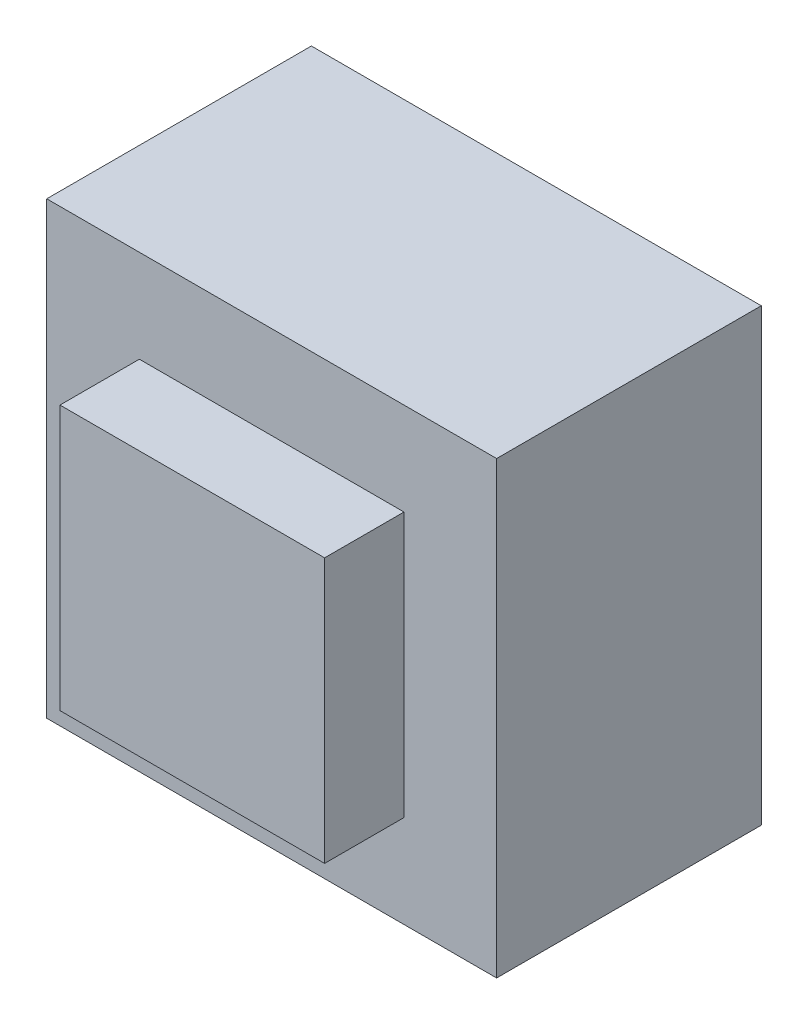
ISO-10303-21;
HEADER;
FILE_DESCRIPTION(('STEP AP214'),'2;1');
FILE_NAME('part.step','',(''),(''),'','','');
FILE_SCHEMA(('AUTOMOTIVE_DESIGN { 1 0 10303 214 1 1 1 1 }'));
ENDSEC;
DATA;
#1=APPLICATION_CONTEXT('core data for automotive mechanical design processes');
#2=APPLICATION_PROTOCOL_DEFINITION('international standard','automotive_design',2000,#1);
#3=PRODUCT_CONTEXT('',#1,'mechanical');
#4=PRODUCT('Part','Part','',(#3));
#5=PRODUCT_RELATED_PRODUCT_CATEGORY('part','',(#4));
#6=PRODUCT_DEFINITION_FORMATION('','',#4);
#7=PRODUCT_DEFINITION_CONTEXT('part definition',#1,'design');
#8=PRODUCT_DEFINITION('design','',#6,#7);
#9=PRODUCT_DEFINITION_SHAPE('','',#8);
#10=(LENGTH_UNIT() NAMED_UNIT(*) SI_UNIT(.MILLI.,.METRE.));
#11=(NAMED_UNIT(*) PLANE_ANGLE_UNIT() SI_UNIT($,.RADIAN.));
#12=(NAMED_UNIT(*) SI_UNIT($,.STERADIAN.) SOLID_ANGLE_UNIT());
#13=UNCERTAINTY_MEASURE_WITH_UNIT(LENGTH_MEASURE(1.E-05),#10,'distance_accuracy_value','');
#14=(GEOMETRIC_REPRESENTATION_CONTEXT(3) GLOBAL_UNCERTAINTY_ASSIGNED_CONTEXT((#13)) GLOBAL_UNIT_ASSIGNED_CONTEXT((#10,
#11,#12)) REPRESENTATION_CONTEXT('',''));
#15=CARTESIAN_POINT('',(0.,0.,0.));
#16=DIRECTION('',(0.,0.,1.));
#17=DIRECTION('',(1.,0.,0.));
#18=AXIS2_PLACEMENT_3D('',#15,#16,#17);
#19=CARTESIAN_POINT('',(0.,0.,1.));
#20=DIRECTION('',(0.,1.,0.));
#21=DIRECTION('',(-1.,0.,0.));
#22=AXIS2_PLACEMENT_3D('',#19,#20,#21);
#23=PLANE('',#22);
#24=DIRECTION('',(1.,0.,0.));
#25=VECTOR('',#24,1.);
#26=CARTESIAN_POINT('',(0.,0.,0.));
#27=LINE('',#26,#25);
#28=CARTESIAN_POINT('',(0.,0.,0.));
#29=VERTEX_POINT('',#28);
#30=CARTESIAN_POINT('',(1.7,0.,0.));
#31=VERTEX_POINT('',#30);
#32=EDGE_CURVE('E121',#29,#31,#27,.T.);
#33=ORIENTED_EDGE('',*,*,#32,.T.);
#34=DIRECTION('',(0.,0.,-1.));
#35=VECTOR('',#34,1.);
#36=CARTESIAN_POINT('',(1.7,0.,1.));
#37=LINE('',#36,#35);
#38=CARTESIAN_POINT('',(1.7,0.,1.));
#39=VERTEX_POINT('',#38);
#40=EDGE_CURVE('E11',#39,#31,#37,.T.);
#41=ORIENTED_EDGE('',*,*,#40,.F.);
#42=DIRECTION('',(1.,0.,0.));
#43=VECTOR('',#42,1.);
#44=CARTESIAN_POINT('',(0.,0.,1.));
#45=LINE('',#44,#43);
#46=CARTESIAN_POINT('',(0.,0.,1.));
#47=VERTEX_POINT('',#46);
#48=EDGE_CURVE('E130',#47,#39,#45,.T.);
#49=ORIENTED_EDGE('',*,*,#48,.F.);
#50=DIRECTION('',(0.,0.,-1.));
#51=VECTOR('',#50,1.);
#52=CARTESIAN_POINT('',(0.,0.,1.));
#53=LINE('',#52,#51);
#54=EDGE_CURVE('E139',#47,#29,#53,.T.);
#55=ORIENTED_EDGE('',*,*,#54,.T.);
#56=EDGE_LOOP('',(#33,#41,#49,#55));
#57=FACE_BOUND('',#56,.T.);
#58=ADVANCED_FACE('F37',(#57),#23,.F.);
#59=CARTESIAN_POINT('',(1.7,0.,1.));
#60=DIRECTION('',(-1.,0.,0.));
#61=DIRECTION('',(0.,-1.,0.));
#62=AXIS2_PLACEMENT_3D('',#59,#60,#61);
#63=PLANE('',#62);
#64=DIRECTION('',(0.,1.,0.));
#65=VECTOR('',#64,1.);
#66=CARTESIAN_POINT('',(1.7,0.,0.));
#67=LINE('',#66,#65);
#68=CARTESIAN_POINT('',(1.7,1.7,0.));
#69=VERTEX_POINT('',#68);
#70=EDGE_CURVE('E124',#31,#69,#67,.T.);
#71=ORIENTED_EDGE('',*,*,#70,.T.);
#72=DIRECTION('',(0.,0.,-1.));
#73=VECTOR('',#72,1.);
#74=CARTESIAN_POINT('',(1.7,1.7,1.));
#75=LINE('',#74,#73);
#76=CARTESIAN_POINT('',(1.7,1.7,1.));
#77=VERTEX_POINT('',#76);
#78=EDGE_CURVE('E44',#77,#69,#75,.T.);
#79=ORIENTED_EDGE('',*,*,#78,.F.);
#80=DIRECTION('',(0.,1.,0.));
#81=VECTOR('',#80,1.);
#82=CARTESIAN_POINT('',(1.7,0.,1.));
#83=LINE('',#82,#81);
#84=EDGE_CURVE('E133',#39,#77,#83,.T.);
#85=ORIENTED_EDGE('',*,*,#84,.F.);
#86=ORIENTED_EDGE('',*,*,#40,.T.);
#87=EDGE_LOOP('',(#71,#79,#85,#86));
#88=FACE_BOUND('',#87,.T.);
#89=ADVANCED_FACE('F170',(#88),#63,.F.);
#90=CARTESIAN_POINT('',(0.,1.7,1.));
#91=DIRECTION('',(0.,-1.,0.));
#92=DIRECTION('',(0.,0.,-1.));
#93=AXIS2_PLACEMENT_3D('',#90,#91,#92);
#94=PLANE('',#93);
#95=DIRECTION('',(-1.,0.,0.));
#96=VECTOR('',#95,1.);
#97=CARTESIAN_POINT('',(0.,1.7,0.));
#98=LINE('',#97,#96);
#99=CARTESIAN_POINT('',(0.,1.7,0.));
#100=VERTEX_POINT('',#99);
#101=EDGE_CURVE('E142',#69,#100,#98,.T.);
#102=ORIENTED_EDGE('',*,*,#101,.T.);
#103=DIRECTION('',(0.,0.,-1.));
#104=VECTOR('',#103,1.);
#105=CARTESIAN_POINT('',(0.,1.7,1.));
#106=LINE('',#105,#104);
#107=CARTESIAN_POINT('',(0.,1.7,1.));
#108=VERTEX_POINT('',#107);
#109=EDGE_CURVE('E147',#108,#100,#106,.T.);
#110=ORIENTED_EDGE('',*,*,#109,.F.);
#111=DIRECTION('',(-1.,0.,0.));
#112=VECTOR('',#111,1.);
#113=CARTESIAN_POINT('',(0.,1.7,1.));
#114=LINE('',#113,#112);
#115=EDGE_CURVE('E136',#77,#108,#114,.T.);
#116=ORIENTED_EDGE('',*,*,#115,.F.);
#117=ORIENTED_EDGE('',*,*,#78,.T.);
#118=EDGE_LOOP('',(#102,#110,#116,#117));
#119=FACE_BOUND('',#118,.T.);
#120=ADVANCED_FACE('F154',(#119),#94,.F.);
#121=CARTESIAN_POINT('',(0.,0.,1.));
#122=DIRECTION('',(1.,0.,0.));
#123=DIRECTION('',(0.,0.,-1.));
#124=AXIS2_PLACEMENT_3D('',#121,#122,#123);
#125=PLANE('',#124);
#126=DIRECTION('',(0.,-1.,0.));
#127=VECTOR('',#126,1.);
#128=CARTESIAN_POINT('',(0.,0.,0.));
#129=LINE('',#128,#127);
#130=EDGE_CURVE('E134',#100,#29,#129,.T.);
#131=ORIENTED_EDGE('',*,*,#130,.T.);
#132=ORIENTED_EDGE('',*,*,#54,.F.);
#133=DIRECTION('',(0.,-1.,0.));
#134=VECTOR('',#133,1.);
#135=CARTESIAN_POINT('',(0.,0.,1.));
#136=LINE('',#135,#134);
#137=EDGE_CURVE('E138',#108,#47,#136,.T.);
#138=ORIENTED_EDGE('',*,*,#137,.F.);
#139=ORIENTED_EDGE('',*,*,#109,.T.);
#140=EDGE_LOOP('',(#131,#132,#138,#139));
#141=FACE_BOUND('',#140,.T.);
#142=ADVANCED_FACE('F163',(#141),#125,.F.);
#143=CARTESIAN_POINT('',(0.,0.,1.));
#144=DIRECTION('',(0.,0.,1.));
#145=DIRECTION('',(1.,0.,0.));
#146=AXIS2_PLACEMENT_3D('',#143,#144,#145);
#147=PLANE('',#146);
#148=DIRECTION('',(-1.,0.,0.));
#149=VECTOR('',#148,1.);
#150=CARTESIAN_POINT('',(0.35,1.35,1.));
#151=LINE('',#150,#149);
#152=CARTESIAN_POINT('',(1.35,1.35,1.));
#153=VERTEX_POINT('',#152);
#154=CARTESIAN_POINT('',(0.35,1.35,1.));
#155=VERTEX_POINT('',#154);
#156=EDGE_CURVE('E51',#153,#155,#151,.T.);
#157=ORIENTED_EDGE('',*,*,#156,.F.);
#158=DIRECTION('',(0.,1.,0.));
#159=VECTOR('',#158,1.);
#160=CARTESIAN_POINT('',(1.35,1.35,1.));
#161=LINE('',#160,#159);
#162=CARTESIAN_POINT('',(1.35,0.35,1.));
#163=VERTEX_POINT('',#162);
#164=EDGE_CURVE('E55',#163,#153,#161,.T.);
#165=ORIENTED_EDGE('',*,*,#164,.F.);
#166=DIRECTION('',(1.,0.,0.));
#167=VECTOR('',#166,1.);
#168=CARTESIAN_POINT('',(0.35,0.35,1.));
#169=LINE('',#168,#167);
#170=CARTESIAN_POINT('',(0.35,0.35,1.));
#171=VERTEX_POINT('',#170);
#172=EDGE_CURVE('E264',#171,#163,#169,.T.);
#173=ORIENTED_EDGE('',*,*,#172,.F.);
#174=DIRECTION('',(0.,-1.,0.));
#175=VECTOR('',#174,1.);
#176=CARTESIAN_POINT('',(0.35,1.35,1.));
#177=LINE('',#176,#175);
#178=EDGE_CURVE('E270',#155,#171,#177,.T.);
#179=ORIENTED_EDGE('',*,*,#178,.F.);
#180=EDGE_LOOP('',(#157,#165,#173,#179));
#181=FACE_BOUND('',#180,.T.);
#182=ORIENTED_EDGE('',*,*,#48,.T.);
#183=ORIENTED_EDGE('',*,*,#84,.T.);
#184=ORIENTED_EDGE('',*,*,#115,.T.);
#185=ORIENTED_EDGE('',*,*,#137,.T.);
#186=EDGE_LOOP('',(#182,#183,#184,#185));
#187=FACE_BOUND('',#186,.T.);
#188=ADVANCED_FACE('F169',(#181,#187),#147,.T.);
#189=CARTESIAN_POINT('',(0.,0.,0.));
#190=DIRECTION('',(0.,0.,1.));
#191=DIRECTION('',(1.,0.,0.));
#192=AXIS2_PLACEMENT_3D('',#189,#190,#191);
#193=PLANE('',#192);
#194=ORIENTED_EDGE('',*,*,#32,.F.);
#195=ORIENTED_EDGE('',*,*,#130,.F.);
#196=ORIENTED_EDGE('',*,*,#101,.F.);
#197=ORIENTED_EDGE('',*,*,#70,.F.);
#198=EDGE_LOOP('',(#194,#195,#196,#197));
#199=FACE_BOUND('',#198,.T.);
#200=ADVANCED_FACE('F160',(#199),#193,.F.);
#201=CARTESIAN_POINT('',(0.35,1.35,1.3));
#202=DIRECTION('',(0.,-1.,0.));
#203=DIRECTION('',(1.,0.,0.));
#204=AXIS2_PLACEMENT_3D('',#201,#202,#203);
#205=PLANE('',#204);
#206=ORIENTED_EDGE('',*,*,#156,.T.);
#207=DIRECTION('',(0.,0.,-1.));
#208=VECTOR('',#207,1.);
#209=CARTESIAN_POINT('',(0.35,1.35,1.3));
#210=LINE('',#209,#208);
#211=CARTESIAN_POINT('',(0.35,1.35,1.3));
#212=VERTEX_POINT('',#211);
#213=EDGE_CURVE('E104',#212,#155,#210,.T.);
#214=ORIENTED_EDGE('',*,*,#213,.F.);
#215=DIRECTION('',(-1.,0.,0.));
#216=VECTOR('',#215,1.);
#217=CARTESIAN_POINT('',(0.35,1.35,1.3));
#218=LINE('',#217,#216);
#219=CARTESIAN_POINT('',(1.35,1.35,1.3));
#220=VERTEX_POINT('',#219);
#221=EDGE_CURVE('E110',#220,#212,#218,.T.);
#222=ORIENTED_EDGE('',*,*,#221,.F.);
#223=DIRECTION('',(0.,0.,-1.));
#224=VECTOR('',#223,1.);
#225=CARTESIAN_POINT('',(1.35,1.35,1.3));
#226=LINE('',#225,#224);
#227=EDGE_CURVE('E262',#220,#153,#226,.T.);
#228=ORIENTED_EDGE('',*,*,#227,.T.);
#229=EDGE_LOOP('',(#206,#214,#222,#228));
#230=FACE_BOUND('',#229,.T.);
#231=ADVANCED_FACE('F120',(#230),#205,.F.);
#232=CARTESIAN_POINT('',(0.35,1.35,1.3));
#233=DIRECTION('',(1.,0.,0.));
#234=DIRECTION('',(0.,1.,0.));
#235=AXIS2_PLACEMENT_3D('',#232,#233,#234);
#236=PLANE('',#235);
#237=ORIENTED_EDGE('',*,*,#178,.T.);
#238=DIRECTION('',(0.,0.,-1.));
#239=VECTOR('',#238,1.);
#240=CARTESIAN_POINT('',(0.35,0.35,1.3));
#241=LINE('',#240,#239);
#242=CARTESIAN_POINT('',(0.35,0.35,1.3));
#243=VERTEX_POINT('',#242);
#244=EDGE_CURVE('E106',#243,#171,#241,.T.);
#245=ORIENTED_EDGE('',*,*,#244,.F.);
#246=DIRECTION('',(0.,-1.,0.));
#247=VECTOR('',#246,1.);
#248=CARTESIAN_POINT('',(0.35,1.35,1.3));
#249=LINE('',#248,#247);
#250=EDGE_CURVE('E99',#212,#243,#249,.T.);
#251=ORIENTED_EDGE('',*,*,#250,.F.);
#252=ORIENTED_EDGE('',*,*,#213,.T.);
#253=EDGE_LOOP('',(#237,#245,#251,#252));
#254=FACE_BOUND('',#253,.T.);
#255=ADVANCED_FACE('F102',(#254),#236,.F.);
#256=CARTESIAN_POINT('',(0.35,0.35,1.3));
#257=DIRECTION('',(0.,1.,0.));
#258=DIRECTION('',(-1.,0.,0.));
#259=AXIS2_PLACEMENT_3D('',#256,#257,#258);
#260=PLANE('',#259);
#261=ORIENTED_EDGE('',*,*,#172,.T.);
#262=DIRECTION('',(0.,0.,-1.));
#263=VECTOR('',#262,1.);
#264=CARTESIAN_POINT('',(1.35,0.35,1.3));
#265=LINE('',#264,#263);
#266=CARTESIAN_POINT('',(1.35,0.35,1.3));
#267=VERTEX_POINT('',#266);
#268=EDGE_CURVE('E126',#267,#163,#265,.T.);
#269=ORIENTED_EDGE('',*,*,#268,.F.);
#270=DIRECTION('',(1.,0.,0.));
#271=VECTOR('',#270,1.);
#272=CARTESIAN_POINT('',(0.35,0.35,1.3));
#273=LINE('',#272,#271);
#274=EDGE_CURVE('E109',#243,#267,#273,.T.);
#275=ORIENTED_EDGE('',*,*,#274,.F.);
#276=ORIENTED_EDGE('',*,*,#244,.T.);
#277=EDGE_LOOP('',(#261,#269,#275,#276));
#278=FACE_BOUND('',#277,.T.);
#279=ADVANCED_FACE('F188',(#278),#260,.F.);
#280=CARTESIAN_POINT('',(1.35,1.35,1.3));
#281=DIRECTION('',(-1.,0.,0.));
#282=DIRECTION('',(0.,0.,1.));
#283=AXIS2_PLACEMENT_3D('',#280,#281,#282);
#284=PLANE('',#283);
#285=ORIENTED_EDGE('',*,*,#164,.T.);
#286=ORIENTED_EDGE('',*,*,#227,.F.);
#287=DIRECTION('',(0.,1.,0.));
#288=VECTOR('',#287,1.);
#289=CARTESIAN_POINT('',(1.35,1.35,1.3));
#290=LINE('',#289,#288);
#291=EDGE_CURVE('E115',#267,#220,#290,.T.);
#292=ORIENTED_EDGE('',*,*,#291,.F.);
#293=ORIENTED_EDGE('',*,*,#268,.T.);
#294=EDGE_LOOP('',(#285,#286,#292,#293));
#295=FACE_BOUND('',#294,.T.);
#296=ADVANCED_FACE('F191',(#295),#284,.F.);
#297=CARTESIAN_POINT('',(0.,0.,1.3));
#298=DIRECTION('',(0.,0.,-1.));
#299=DIRECTION('',(-1.,0.,0.));
#300=AXIS2_PLACEMENT_3D('',#297,#298,#299);
#301=PLANE('',#300);
#302=ORIENTED_EDGE('',*,*,#221,.T.);
#303=ORIENTED_EDGE('',*,*,#250,.T.);
#304=ORIENTED_EDGE('',*,*,#274,.T.);
#305=ORIENTED_EDGE('',*,*,#291,.T.);
#306=EDGE_LOOP('',(#302,#303,#304,#305));
#307=FACE_BOUND('',#306,.T.);
#308=ADVANCED_FACE('F113',(#307),#301,.F.);
#309=CLOSED_SHELL('',(#58,#89,#120,#142,#188,#200,#231,#255,#279,#296,#308));
#310=MANIFOLD_SOLID_BREP('B2',#309);
#311=ADVANCED_BREP_SHAPE_REPRESENTATION('',(#18,#310),#14);
#312=SHAPE_DEFINITION_REPRESENTATION(#9,#311);
ENDSEC;
END-ISO-10303-21;
